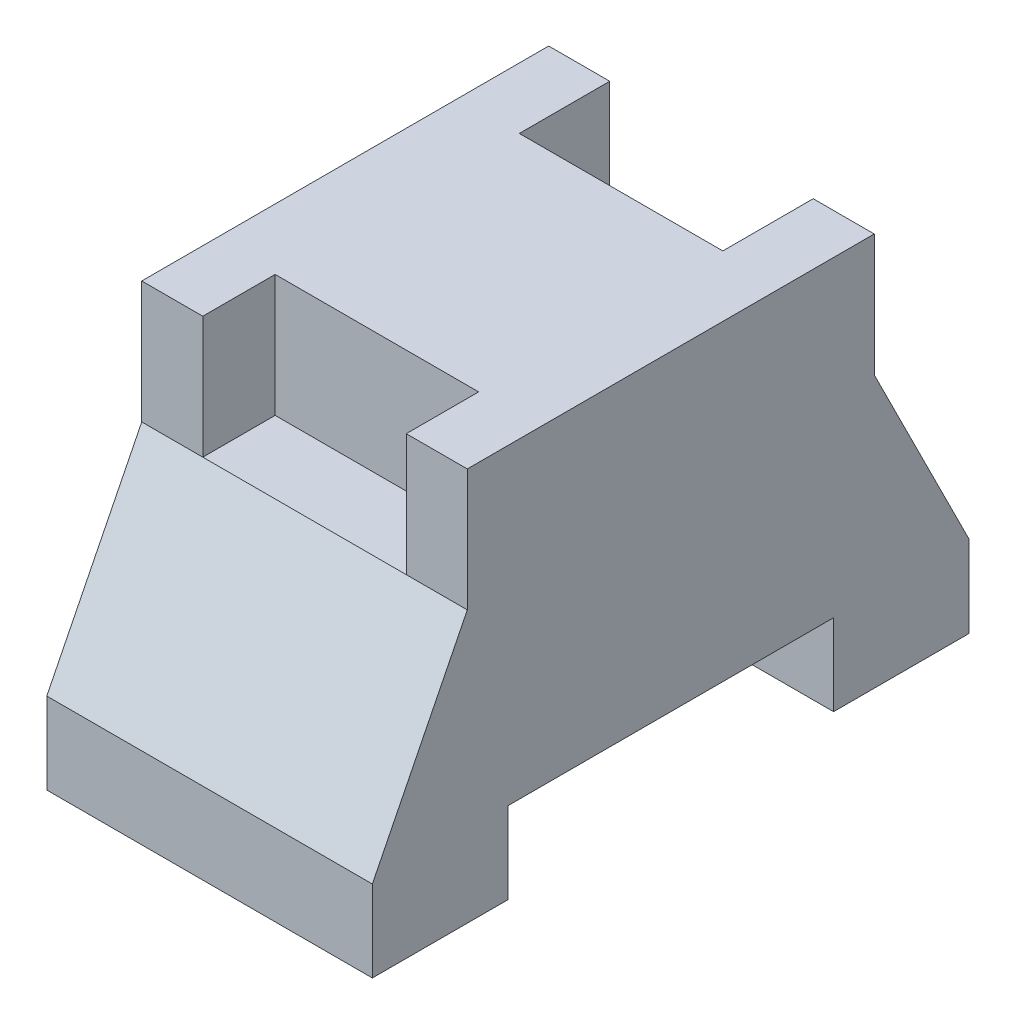
ISO-10303-21;
HEADER;
FILE_DESCRIPTION(('STEP AP214'),'2;1');
FILE_NAME('part.step','',(''),(''),'','','');
FILE_SCHEMA(('AUTOMOTIVE_DESIGN { 1 0 10303 214 1 1 1 1 }'));
ENDSEC;
DATA;
#1=APPLICATION_CONTEXT('core data for automotive mechanical design processes');
#2=APPLICATION_PROTOCOL_DEFINITION('international standard','automotive_design',2000,#1);
#3=PRODUCT_CONTEXT('',#1,'mechanical');
#4=PRODUCT('Part','Part','',(#3));
#5=PRODUCT_RELATED_PRODUCT_CATEGORY('part','',(#4));
#6=PRODUCT_DEFINITION_FORMATION('','',#4);
#7=PRODUCT_DEFINITION_CONTEXT('part definition',#1,'design');
#8=PRODUCT_DEFINITION('design','',#6,#7);
#9=PRODUCT_DEFINITION_SHAPE('','',#8);
#10=(LENGTH_UNIT() NAMED_UNIT(*) SI_UNIT(.MILLI.,.METRE.));
#11=(NAMED_UNIT(*) PLANE_ANGLE_UNIT() SI_UNIT($,.RADIAN.));
#12=(NAMED_UNIT(*) SI_UNIT($,.STERADIAN.) SOLID_ANGLE_UNIT());
#13=UNCERTAINTY_MEASURE_WITH_UNIT(LENGTH_MEASURE(1.E-05),#10,'distance_accuracy_value','');
#14=(GEOMETRIC_REPRESENTATION_CONTEXT(3) GLOBAL_UNCERTAINTY_ASSIGNED_CONTEXT((#13)) GLOBAL_UNIT_ASSIGNED_CONTEXT((#10,
#11,#12)) REPRESENTATION_CONTEXT('',''));
#15=CARTESIAN_POINT('',(0.,0.,0.));
#16=DIRECTION('',(0.,0.,1.));
#17=DIRECTION('',(1.,0.,0.));
#18=AXIS2_PLACEMENT_3D('',#15,#16,#17);
#19=CARTESIAN_POINT('',(-48.,0.,37.1891560630895));
#20=DIRECTION('',(0.,0.,-1.));
#21=DIRECTION('',(-1.,0.,0.));
#22=AXIS2_PLACEMENT_3D('',#19,#20,#21);
#23=PLANE('',#22);
#24=DIRECTION('',(1.,0.,0.));
#25=VECTOR('',#24,1.);
#26=CARTESIAN_POINT('',(-48.,28.,37.1891560630895));
#27=LINE('',#26,#25);
#28=CARTESIAN_POINT('',(-48.,28.,37.1891560630895));
#29=VERTEX_POINT('',#28);
#30=CARTESIAN_POINT('',(-39.,28.,37.1891560630895));
#31=VERTEX_POINT('',#30);
#32=EDGE_CURVE('E212',#29,#31,#27,.T.);
#33=ORIENTED_EDGE('',*,*,#32,.T.);
#34=DIRECTION('',(0.,1.,0.));
#35=VECTOR('',#34,1.);
#36=CARTESIAN_POINT('',(-39.,28.,37.1891560630895));
#37=LINE('',#36,#35);
#38=CARTESIAN_POINT('',(-39.,46.,37.1891560630895));
#39=VERTEX_POINT('',#38);
#40=EDGE_CURVE('E260',#31,#39,#37,.T.);
#41=ORIENTED_EDGE('',*,*,#40,.T.);
#42=DIRECTION('',(1.,0.,0.));
#43=VECTOR('',#42,1.);
#44=CARTESIAN_POINT('',(-48.,46.,37.1891560630895));
#45=LINE('',#44,#43);
#46=CARTESIAN_POINT('',(-48.,46.,37.1891560630895));
#47=VERTEX_POINT('',#46);
#48=EDGE_CURVE('E213',#47,#39,#45,.T.);
#49=ORIENTED_EDGE('',*,*,#48,.F.);
#50=DIRECTION('',(0.,1.,0.));
#51=VECTOR('',#50,1.);
#52=CARTESIAN_POINT('',(-48.,0.,37.1891560630895));
#53=LINE('',#52,#51);
#54=EDGE_CURVE('E357',#29,#47,#53,.T.);
#55=ORIENTED_EDGE('',*,*,#54,.F.);
#56=EDGE_LOOP('',(#33,#41,#49,#55));
#57=FACE_BOUND('',#56,.T.);
#58=ADVANCED_FACE('F39',(#57),#23,.F.);
#59=CARTESIAN_POINT('',(-48.,0.,-22.8108439369105));
#60=DIRECTION('',(0.,0.,1.));
#61=DIRECTION('',(0.,-1.,0.));
#62=AXIS2_PLACEMENT_3D('',#59,#60,#61);
#63=PLANE('',#62);
#64=DIRECTION('',(1.,0.,0.));
#65=VECTOR('',#64,1.);
#66=CARTESIAN_POINT('',(-48.,28.,-22.8108439369105));
#67=LINE('',#66,#65);
#68=CARTESIAN_POINT('',(-8.99999999999999,28.,-22.8108439369105));
#69=VERTEX_POINT('',#68);
#70=CARTESIAN_POINT('',(0.,28.,-22.8108439369105));
#71=VERTEX_POINT('',#70);
#72=EDGE_CURVE('E228',#69,#71,#67,.T.);
#73=ORIENTED_EDGE('',*,*,#72,.F.);
#74=DIRECTION('',(0.,1.,0.));
#75=VECTOR('',#74,1.);
#76=CARTESIAN_POINT('',(-8.99999999999999,28.,-22.8108439369105));
#77=LINE('',#76,#75);
#78=CARTESIAN_POINT('',(-8.99999999999999,46.,-22.8108439369105));
#79=VERTEX_POINT('',#78);
#80=EDGE_CURVE('E329',#69,#79,#77,.T.);
#81=ORIENTED_EDGE('',*,*,#80,.T.);
#82=DIRECTION('',(1.,0.,0.));
#83=VECTOR('',#82,1.);
#84=CARTESIAN_POINT('',(-48.,46.,-22.8108439369105));
#85=LINE('',#84,#83);
#86=CARTESIAN_POINT('',(0.,46.,-22.8108439369105));
#87=VERTEX_POINT('',#86);
#88=EDGE_CURVE('E224',#79,#87,#85,.T.);
#89=ORIENTED_EDGE('',*,*,#88,.T.);
#90=DIRECTION('',(0.,-1.,0.));
#91=VECTOR('',#90,1.);
#92=CARTESIAN_POINT('',(0.,0.,-22.8108439369105));
#93=LINE('',#92,#91);
#94=EDGE_CURVE('E268',#87,#71,#93,.T.);
#95=ORIENTED_EDGE('',*,*,#94,.T.);
#96=EDGE_LOOP('',(#73,#81,#89,#95));
#97=FACE_BOUND('',#96,.T.);
#98=ADVANCED_FACE('F376',(#97),#63,.F.);
#99=CARTESIAN_POINT('',(-48.,0.,0.));
#100=DIRECTION('',(0.,-1.,0.));
#101=DIRECTION('',(0.,0.,-1.));
#102=AXIS2_PLACEMENT_3D('',#99,#100,#101);
#103=PLANE('',#102);
#104=DIRECTION('',(0.,0.,-1.));
#105=VECTOR('',#104,1.);
#106=CARTESIAN_POINT('',(0.,0.,0.));
#107=LINE('',#106,#105);
#108=CARTESIAN_POINT('',(0.,0.,31.1891560630895));
#109=VERTEX_POINT('',#108);
#110=CARTESIAN_POINT('',(0.,0.,-16.8108439369105));
#111=VERTEX_POINT('',#110);
#112=EDGE_CURVE('E256',#109,#111,#107,.T.);
#113=ORIENTED_EDGE('',*,*,#112,.F.);
#114=DIRECTION('',(1.,0.,0.));
#115=VECTOR('',#114,1.);
#116=CARTESIAN_POINT('',(-48.,0.,31.1891560630895));
#117=LINE('',#116,#115);
#118=CARTESIAN_POINT('',(-48.,0.,31.1891560630895));
#119=VERTEX_POINT('',#118);
#120=EDGE_CURVE('E11',#119,#109,#117,.T.);
#121=ORIENTED_EDGE('',*,*,#120,.F.);
#122=DIRECTION('',(0.,0.,-1.));
#123=VECTOR('',#122,1.);
#124=CARTESIAN_POINT('',(-48.,0.,0.));
#125=LINE('',#124,#123);
#126=CARTESIAN_POINT('',(-48.,0.,-16.8108439369105));
#127=VERTEX_POINT('',#126);
#128=EDGE_CURVE('E284',#119,#127,#125,.T.);
#129=ORIENTED_EDGE('',*,*,#128,.T.);
#130=DIRECTION('',(1.,0.,0.));
#131=VECTOR('',#130,1.);
#132=CARTESIAN_POINT('',(-48.,0.,-16.8108439369105));
#133=LINE('',#132,#131);
#134=EDGE_CURVE('E43',#127,#111,#133,.T.);
#135=ORIENTED_EDGE('',*,*,#134,.T.);
#136=EDGE_LOOP('',(#113,#121,#129,#135));
#137=FACE_BOUND('',#136,.T.);
#138=ADVANCED_FACE('F41',(#137),#103,.T.);
#139=CARTESIAN_POINT('',(-48.,0.,31.1891560630895));
#140=DIRECTION('',(0.,0.,-1.));
#141=DIRECTION('',(-1.,0.,0.));
#142=AXIS2_PLACEMENT_3D('',#139,#140,#141);
#143=PLANE('',#142);
#144=DIRECTION('',(0.,1.,0.));
#145=VECTOR('',#144,1.);
#146=CARTESIAN_POINT('',(0.,0.,31.1891560630895));
#147=LINE('',#146,#145);
#148=CARTESIAN_POINT('',(0.,-12.,31.1891560630895));
#149=VERTEX_POINT('',#148);
#150=EDGE_CURVE('E282',#149,#109,#147,.T.);
#151=ORIENTED_EDGE('',*,*,#150,.F.);
#152=DIRECTION('',(1.,0.,0.));
#153=VECTOR('',#152,1.);
#154=CARTESIAN_POINT('',(-48.,-12.,31.1891560630895));
#155=LINE('',#154,#153);
#156=CARTESIAN_POINT('',(-48.,-12.,31.1891560630895));
#157=VERTEX_POINT('',#156);
#158=EDGE_CURVE('E48',#157,#149,#155,.T.);
#159=ORIENTED_EDGE('',*,*,#158,.F.);
#160=DIRECTION('',(0.,1.,0.));
#161=VECTOR('',#160,1.);
#162=CARTESIAN_POINT('',(-48.,0.,31.1891560630895));
#163=LINE('',#162,#161);
#164=EDGE_CURVE('E241',#157,#119,#163,.T.);
#165=ORIENTED_EDGE('',*,*,#164,.T.);
#166=ORIENTED_EDGE('',*,*,#120,.T.);
#167=EDGE_LOOP('',(#151,#159,#165,#166));
#168=FACE_BOUND('',#167,.T.);
#169=ADVANCED_FACE('F372',(#168),#143,.T.);
#170=CARTESIAN_POINT('',(-48.,-12.,0.));
#171=DIRECTION('',(0.,-1.,0.));
#172=DIRECTION('',(0.,0.,-1.));
#173=AXIS2_PLACEMENT_3D('',#170,#171,#172);
#174=PLANE('',#173);
#175=DIRECTION('',(0.,0.,-1.));
#176=VECTOR('',#175,1.);
#177=CARTESIAN_POINT('',(0.,-12.,0.));
#178=LINE('',#177,#176);
#179=CARTESIAN_POINT('',(0.,-12.,51.1891560630895));
#180=VERTEX_POINT('',#179);
#181=EDGE_CURVE('E279',#180,#149,#178,.T.);
#182=ORIENTED_EDGE('',*,*,#181,.F.);
#183=DIRECTION('',(1.,0.,0.));
#184=VECTOR('',#183,1.);
#185=CARTESIAN_POINT('',(-48.,-12.,51.1891560630895));
#186=LINE('',#185,#184);
#187=CARTESIAN_POINT('',(-48.,-12.,51.1891560630895));
#188=VERTEX_POINT('',#187);
#189=EDGE_CURVE('E286',#188,#180,#186,.T.);
#190=ORIENTED_EDGE('',*,*,#189,.F.);
#191=DIRECTION('',(0.,0.,-1.));
#192=VECTOR('',#191,1.);
#193=CARTESIAN_POINT('',(-48.,-12.,0.));
#194=LINE('',#193,#192);
#195=EDGE_CURVE('E247',#188,#157,#194,.T.);
#196=ORIENTED_EDGE('',*,*,#195,.T.);
#197=ORIENTED_EDGE('',*,*,#158,.T.);
#198=EDGE_LOOP('',(#182,#190,#196,#197));
#199=FACE_BOUND('',#198,.T.);
#200=ADVANCED_FACE('F365',(#199),#174,.T.);
#201=CARTESIAN_POINT('',(-48.,0.,51.1891560630895));
#202=DIRECTION('',(0.,0.,-1.));
#203=DIRECTION('',(-1.,0.,0.));
#204=AXIS2_PLACEMENT_3D('',#201,#202,#203);
#205=PLANE('',#204);
#206=DIRECTION('',(0.,1.,0.));
#207=VECTOR('',#206,1.);
#208=CARTESIAN_POINT('',(0.,0.,51.1891560630895));
#209=LINE('',#208,#207);
#210=CARTESIAN_POINT('',(0.,0.,51.1891560630895));
#211=VERTEX_POINT('',#210);
#212=EDGE_CURVE('E277',#180,#211,#209,.T.);
#213=ORIENTED_EDGE('',*,*,#212,.T.);
#214=DIRECTION('',(1.,0.,0.));
#215=VECTOR('',#214,1.);
#216=CARTESIAN_POINT('',(-48.,0.,51.1891560630895));
#217=LINE('',#216,#215);
#218=CARTESIAN_POINT('',(-48.,0.,51.1891560630895));
#219=VERTEX_POINT('',#218);
#220=EDGE_CURVE('E215',#219,#211,#217,.T.);
#221=ORIENTED_EDGE('',*,*,#220,.F.);
#222=DIRECTION('',(0.,1.,0.));
#223=VECTOR('',#222,1.);
#224=CARTESIAN_POINT('',(-48.,0.,51.1891560630895));
#225=LINE('',#224,#223);
#226=EDGE_CURVE('E252',#188,#219,#225,.T.);
#227=ORIENTED_EDGE('',*,*,#226,.F.);
#228=ORIENTED_EDGE('',*,*,#189,.T.);
#229=EDGE_LOOP('',(#213,#221,#227,#228));
#230=FACE_BOUND('',#229,.T.);
#231=ADVANCED_FACE('F363',(#230),#205,.F.);
#232=CARTESIAN_POINT('',(-48.,20.4756624252358,40.9513248504716));
#233=DIRECTION('',(0.,-0.447213595499958,-0.894427190999916));
#234=DIRECTION('',(0.,0.894427190999916,-0.447213595499958));
#235=AXIS2_PLACEMENT_3D('',#232,#233,#234);
#236=PLANE('',#235);
#237=DIRECTION('',(0.,0.894427190999916,-0.447213595499958));
#238=VECTOR('',#237,1.);
#239=CARTESIAN_POINT('',(0.,20.4756624252358,40.9513248504716));
#240=LINE('',#239,#238);
#241=CARTESIAN_POINT('',(0.,28.,37.1891560630895));
#242=VERTEX_POINT('',#241);
#243=EDGE_CURVE('E210',#211,#242,#240,.T.);
#244=ORIENTED_EDGE('',*,*,#243,.T.);
#245=CARTESIAN_POINT('',(-9.,28.,37.1891560630895));
#246=VERTEX_POINT('',#245);
#247=EDGE_CURVE('E203',#246,#242,#27,.T.);
#248=ORIENTED_EDGE('',*,*,#247,.F.);
#249=DIRECTION('',(1.,0.,0.));
#250=VECTOR('',#249,1.);
#251=CARTESIAN_POINT('',(-39.,28.,37.1891560630895));
#252=LINE('',#251,#250);
#253=EDGE_CURVE('E186',#31,#246,#252,.T.);
#254=ORIENTED_EDGE('',*,*,#253,.F.);
#255=ORIENTED_EDGE('',*,*,#32,.F.);
#256=DIRECTION('',(0.,0.894427190999916,-0.447213595499958));
#257=VECTOR('',#256,1.);
#258=CARTESIAN_POINT('',(-48.,20.4756624252358,40.9513248504716));
#259=LINE('',#258,#257);
#260=EDGE_CURVE('E292',#219,#29,#259,.T.);
#261=ORIENTED_EDGE('',*,*,#260,.F.);
#262=ORIENTED_EDGE('',*,*,#220,.T.);
#263=EDGE_LOOP('',(#244,#248,#254,#255,#261,#262));
#264=FACE_BOUND('',#263,.T.);
#265=ADVANCED_FACE('F207',(#264),#236,.F.);
#266=CARTESIAN_POINT('',(-8.99999999999999,46.,37.1891560630895));
#267=VERTEX_POINT('',#266);
#268=CARTESIAN_POINT('',(0.,46.,37.1891560630895));
#269=VERTEX_POINT('',#268);
#270=EDGE_CURVE('E205',#267,#269,#45,.T.);
#271=ORIENTED_EDGE('',*,*,#270,.F.);
#272=DIRECTION('',(0.,1.,0.));
#273=VECTOR('',#272,1.);
#274=CARTESIAN_POINT('',(-9.,28.,37.1891560630895));
#275=LINE('',#274,#273);
#276=EDGE_CURVE('E56',#246,#267,#275,.T.);
#277=ORIENTED_EDGE('',*,*,#276,.F.);
#278=ORIENTED_EDGE('',*,*,#247,.T.);
#279=DIRECTION('',(0.,1.,0.));
#280=VECTOR('',#279,1.);
#281=CARTESIAN_POINT('',(0.,0.,37.1891560630895));
#282=LINE('',#281,#280);
#283=EDGE_CURVE('E274',#242,#269,#282,.T.);
#284=ORIENTED_EDGE('',*,*,#283,.T.);
#285=EDGE_LOOP('',(#271,#277,#278,#284));
#286=FACE_BOUND('',#285,.T.);
#287=ADVANCED_FACE('F201',(#286),#23,.F.);
#288=CARTESIAN_POINT('',(-48.,46.,0.));
#289=DIRECTION('',(0.,-1.,0.));
#290=DIRECTION('',(0.,0.,-1.));
#291=AXIS2_PLACEMENT_3D('',#288,#289,#290);
#292=PLANE('',#291);
#293=ORIENTED_EDGE('',*,*,#48,.T.);
#294=DIRECTION('',(0.,0.,1.));
#295=VECTOR('',#294,1.);
#296=CARTESIAN_POINT('',(-39.,46.,37.1891560630895));
#297=LINE('',#296,#295);
#298=CARTESIAN_POINT('',(-39.,46.,26.5178677111091));
#299=VERTEX_POINT('',#298);
#300=EDGE_CURVE('E197',#299,#39,#297,.T.);
#301=ORIENTED_EDGE('',*,*,#300,.F.);
#302=DIRECTION('',(-1.,0.,0.));
#303=VECTOR('',#302,1.);
#304=CARTESIAN_POINT('',(-39.,46.,26.5178677111091));
#305=LINE('',#304,#303);
#306=CARTESIAN_POINT('',(-9.,46.,26.5178677111091));
#307=VERTEX_POINT('',#306);
#308=EDGE_CURVE('E307',#307,#299,#305,.T.);
#309=ORIENTED_EDGE('',*,*,#308,.F.);
#310=DIRECTION('',(0.,0.,-1.));
#311=VECTOR('',#310,1.);
#312=CARTESIAN_POINT('',(-9.,46.,26.5178677111091));
#313=LINE('',#312,#311);
#314=EDGE_CURVE('E304',#267,#307,#313,.T.);
#315=ORIENTED_EDGE('',*,*,#314,.F.);
#316=ORIENTED_EDGE('',*,*,#270,.T.);
#317=DIRECTION('',(0.,0.,-1.));
#318=VECTOR('',#317,1.);
#319=CARTESIAN_POINT('',(0.,46.,0.));
#320=LINE('',#319,#318);
#321=EDGE_CURVE('E271',#269,#87,#320,.T.);
#322=ORIENTED_EDGE('',*,*,#321,.T.);
#323=ORIENTED_EDGE('',*,*,#88,.F.);
#324=DIRECTION('',(0.,0.,-1.));
#325=VECTOR('',#324,1.);
#326=CARTESIAN_POINT('',(-8.99999999999999,46.,-9.48213228889091));
#327=LINE('',#326,#325);
#328=CARTESIAN_POINT('',(-8.99999999999999,46.,-9.48213228889091));
#329=VERTEX_POINT('',#328);
#330=EDGE_CURVE('E332',#329,#79,#327,.T.);
#331=ORIENTED_EDGE('',*,*,#330,.F.);
#332=DIRECTION('',(1.,0.,0.));
#333=VECTOR('',#332,1.);
#334=CARTESIAN_POINT('',(-39.,46.,-9.48213228889091));
#335=LINE('',#334,#333);
#336=CARTESIAN_POINT('',(-39.,46.,-9.48213228889091));
#337=VERTEX_POINT('',#336);
#338=EDGE_CURVE('E312',#337,#329,#335,.T.);
#339=ORIENTED_EDGE('',*,*,#338,.F.);
#340=DIRECTION('',(0.,0.,1.));
#341=VECTOR('',#340,1.);
#342=CARTESIAN_POINT('',(-39.,46.,-22.8108439369105));
#343=LINE('',#342,#341);
#344=CARTESIAN_POINT('',(-39.,46.,-22.8108439369105));
#345=VERTEX_POINT('',#344);
#346=EDGE_CURVE('E308',#345,#337,#343,.T.);
#347=ORIENTED_EDGE('',*,*,#346,.F.);
#348=CARTESIAN_POINT('',(-48.,46.,-22.8108439369105));
#349=VERTEX_POINT('',#348);
#350=EDGE_CURVE('E221',#349,#345,#85,.T.);
#351=ORIENTED_EDGE('',*,*,#350,.F.);
#352=DIRECTION('',(0.,0.,-1.));
#353=VECTOR('',#352,1.);
#354=CARTESIAN_POINT('',(-48.,46.,0.));
#355=LINE('',#354,#353);
#356=EDGE_CURVE('E355',#47,#349,#355,.T.);
#357=ORIENTED_EDGE('',*,*,#356,.F.);
#358=EDGE_LOOP('',(#293,#301,#309,#315,#316,#322,#323,#331,#339,#347,#351,#357));
#359=FACE_BOUND('',#358,.T.);
#360=ADVANCED_FACE('F301',(#359),#292,.F.);
#361=ORIENTED_EDGE('',*,*,#350,.T.);
#362=DIRECTION('',(0.,1.,0.));
#363=VECTOR('',#362,1.);
#364=CARTESIAN_POINT('',(-39.,28.,-22.8108439369105));
#365=LINE('',#364,#363);
#366=CARTESIAN_POINT('',(-39.,28.,-22.8108439369105));
#367=VERTEX_POINT('',#366);
#368=EDGE_CURVE('E323',#367,#345,#365,.T.);
#369=ORIENTED_EDGE('',*,*,#368,.F.);
#370=CARTESIAN_POINT('',(-48.,28.,-22.8108439369105));
#371=VERTEX_POINT('',#370);
#372=EDGE_CURVE('E225',#371,#367,#67,.T.);
#373=ORIENTED_EDGE('',*,*,#372,.F.);
#374=DIRECTION('',(0.,-1.,0.));
#375=VECTOR('',#374,1.);
#376=CARTESIAN_POINT('',(-48.,0.,-22.8108439369105));
#377=LINE('',#376,#375);
#378=EDGE_CURVE('E353',#349,#371,#377,.T.);
#379=ORIENTED_EDGE('',*,*,#378,.F.);
#380=EDGE_LOOP('',(#361,#369,#373,#379));
#381=FACE_BOUND('',#380,.T.);
#382=ADVANCED_FACE('F384',(#381),#63,.F.);
#383=CARTESIAN_POINT('',(-48.,14.7243375747642,-29.4486751495284));
#384=DIRECTION('',(0.,-0.447213595499958,0.894427190999916));
#385=DIRECTION('',(0.,-0.894427190999916,-0.447213595499958));
#386=AXIS2_PLACEMENT_3D('',#383,#384,#385);
#387=PLANE('',#386);
#388=DIRECTION('',(0.,-0.894427190999916,-0.447213595499958));
#389=VECTOR('',#388,1.);
#390=CARTESIAN_POINT('',(0.,14.7243375747642,-29.4486751495284));
#391=LINE('',#390,#389);
#392=CARTESIAN_POINT('',(0.,0.,-36.8108439369105));
#393=VERTEX_POINT('',#392);
#394=EDGE_CURVE('E266',#71,#393,#391,.T.);
#395=ORIENTED_EDGE('',*,*,#394,.T.);
#396=DIRECTION('',(1.,0.,0.));
#397=VECTOR('',#396,1.);
#398=CARTESIAN_POINT('',(-48.,0.,-36.8108439369105));
#399=LINE('',#398,#397);
#400=CARTESIAN_POINT('',(-48.,0.,-36.8108439369105));
#401=VERTEX_POINT('',#400);
#402=EDGE_CURVE('E229',#401,#393,#399,.T.);
#403=ORIENTED_EDGE('',*,*,#402,.F.);
#404=DIRECTION('',(0.,-0.894427190999916,-0.447213595499958));
#405=VECTOR('',#404,1.);
#406=CARTESIAN_POINT('',(-48.,14.7243375747642,-29.4486751495284));
#407=LINE('',#406,#405);
#408=EDGE_CURVE('E351',#371,#401,#407,.T.);
#409=ORIENTED_EDGE('',*,*,#408,.F.);
#410=ORIENTED_EDGE('',*,*,#372,.T.);
#411=DIRECTION('',(-1.,0.,0.));
#412=VECTOR('',#411,1.);
#413=CARTESIAN_POINT('',(-8.99999999999999,28.,-22.8108439369105));
#414=LINE('',#413,#412);
#415=EDGE_CURVE('E334',#69,#367,#414,.T.);
#416=ORIENTED_EDGE('',*,*,#415,.F.);
#417=ORIENTED_EDGE('',*,*,#72,.T.);
#418=EDGE_LOOP('',(#395,#403,#409,#410,#416,#417));
#419=FACE_BOUND('',#418,.T.);
#420=ADVANCED_FACE('F393',(#419),#387,.F.);
#421=CARTESIAN_POINT('',(-48.,0.,-36.8108439369105));
#422=DIRECTION('',(0.,0.,1.));
#423=DIRECTION('',(1.,0.,0.));
#424=AXIS2_PLACEMENT_3D('',#421,#422,#423);
#425=PLANE('',#424);
#426=DIRECTION('',(0.,-1.,0.));
#427=VECTOR('',#426,1.);
#428=CARTESIAN_POINT('',(0.,0.,-36.8108439369105));
#429=LINE('',#428,#427);
#430=CARTESIAN_POINT('',(0.,-12.,-36.8108439369105));
#431=VERTEX_POINT('',#430);
#432=EDGE_CURVE('E264',#393,#431,#429,.T.);
#433=ORIENTED_EDGE('',*,*,#432,.T.);
#434=DIRECTION('',(1.,0.,0.));
#435=VECTOR('',#434,1.);
#436=CARTESIAN_POINT('',(-48.,-12.,-36.8108439369105));
#437=LINE('',#436,#435);
#438=CARTESIAN_POINT('',(-48.,-12.,-36.8108439369105));
#439=VERTEX_POINT('',#438);
#440=EDGE_CURVE('E232',#439,#431,#437,.T.);
#441=ORIENTED_EDGE('',*,*,#440,.F.);
#442=DIRECTION('',(0.,-1.,0.));
#443=VECTOR('',#442,1.);
#444=CARTESIAN_POINT('',(-48.,0.,-36.8108439369105));
#445=LINE('',#444,#443);
#446=EDGE_CURVE('E349',#401,#439,#445,.T.);
#447=ORIENTED_EDGE('',*,*,#446,.F.);
#448=ORIENTED_EDGE('',*,*,#402,.T.);
#449=EDGE_LOOP('',(#433,#441,#447,#448));
#450=FACE_BOUND('',#449,.T.);
#451=ADVANCED_FACE('F398',(#450),#425,.F.);
#452=CARTESIAN_POINT('',(-48.,-12.,0.));
#453=DIRECTION('',(0.,1.,0.));
#454=DIRECTION('',(0.,0.,1.));
#455=AXIS2_PLACEMENT_3D('',#452,#453,#454);
#456=PLANE('',#455);
#457=DIRECTION('',(0.,0.,1.));
#458=VECTOR('',#457,1.);
#459=CARTESIAN_POINT('',(0.,-12.,0.));
#460=LINE('',#459,#458);
#461=CARTESIAN_POINT('',(0.,-12.,-16.8108439369105));
#462=VERTEX_POINT('',#461);
#463=EDGE_CURVE('E262',#431,#462,#460,.T.);
#464=ORIENTED_EDGE('',*,*,#463,.T.);
#465=DIRECTION('',(1.,0.,0.));
#466=VECTOR('',#465,1.);
#467=CARTESIAN_POINT('',(-48.,-12.,-16.8108439369105));
#468=LINE('',#467,#466);
#469=CARTESIAN_POINT('',(-48.,-12.,-16.8108439369105));
#470=VERTEX_POINT('',#469);
#471=EDGE_CURVE('E234',#470,#462,#468,.T.);
#472=ORIENTED_EDGE('',*,*,#471,.F.);
#473=DIRECTION('',(0.,0.,1.));
#474=VECTOR('',#473,1.);
#475=CARTESIAN_POINT('',(-48.,-12.,0.));
#476=LINE('',#475,#474);
#477=EDGE_CURVE('E347',#439,#470,#476,.T.);
#478=ORIENTED_EDGE('',*,*,#477,.F.);
#479=ORIENTED_EDGE('',*,*,#440,.T.);
#480=EDGE_LOOP('',(#464,#472,#478,#479));
#481=FACE_BOUND('',#480,.T.);
#482=ADVANCED_FACE('F402',(#481),#456,.F.);
#483=CARTESIAN_POINT('',(-48.,0.,-16.8108439369105));
#484=DIRECTION('',(0.,0.,-1.));
#485=DIRECTION('',(-1.,0.,0.));
#486=AXIS2_PLACEMENT_3D('',#483,#484,#485);
#487=PLANE('',#486);
#488=DIRECTION('',(0.,1.,0.));
#489=VECTOR('',#488,1.);
#490=CARTESIAN_POINT('',(0.,0.,-16.8108439369105));
#491=LINE('',#490,#489);
#492=EDGE_CURVE('E259',#462,#111,#491,.T.);
#493=ORIENTED_EDGE('',*,*,#492,.T.);
#494=ORIENTED_EDGE('',*,*,#134,.F.);
#495=DIRECTION('',(0.,1.,0.));
#496=VECTOR('',#495,1.);
#497=CARTESIAN_POINT('',(-48.,0.,-16.8108439369105));
#498=LINE('',#497,#496);
#499=EDGE_CURVE('E345',#470,#127,#498,.T.);
#500=ORIENTED_EDGE('',*,*,#499,.F.);
#501=ORIENTED_EDGE('',*,*,#471,.T.);
#502=EDGE_LOOP('',(#493,#494,#500,#501));
#503=FACE_BOUND('',#502,.T.);
#504=ADVANCED_FACE('F405',(#503),#487,.F.);
#505=CARTESIAN_POINT('',(-48.,0.,0.));
#506=DIRECTION('',(1.,0.,0.));
#507=DIRECTION('',(0.,0.,-1.));
#508=AXIS2_PLACEMENT_3D('',#505,#506,#507);
#509=PLANE('',#508);
#510=ORIENTED_EDGE('',*,*,#128,.F.);
#511=ORIENTED_EDGE('',*,*,#164,.F.);
#512=ORIENTED_EDGE('',*,*,#195,.F.);
#513=ORIENTED_EDGE('',*,*,#226,.T.);
#514=ORIENTED_EDGE('',*,*,#260,.T.);
#515=ORIENTED_EDGE('',*,*,#54,.T.);
#516=ORIENTED_EDGE('',*,*,#356,.T.);
#517=ORIENTED_EDGE('',*,*,#378,.T.);
#518=ORIENTED_EDGE('',*,*,#408,.T.);
#519=ORIENTED_EDGE('',*,*,#446,.T.);
#520=ORIENTED_EDGE('',*,*,#477,.T.);
#521=ORIENTED_EDGE('',*,*,#499,.T.);
#522=EDGE_LOOP('',(#510,#511,#512,#513,#514,#515,#516,#517,#518,#519,#520,#521));
#523=FACE_BOUND('',#522,.T.);
#524=ADVANCED_FACE('F362',(#523),#509,.F.);
#525=CARTESIAN_POINT('',(0.,0.,0.));
#526=DIRECTION('',(1.,0.,0.));
#527=DIRECTION('',(0.,0.,-1.));
#528=AXIS2_PLACEMENT_3D('',#525,#526,#527);
#529=PLANE('',#528);
#530=ORIENTED_EDGE('',*,*,#112,.T.);
#531=ORIENTED_EDGE('',*,*,#492,.F.);
#532=ORIENTED_EDGE('',*,*,#463,.F.);
#533=ORIENTED_EDGE('',*,*,#432,.F.);
#534=ORIENTED_EDGE('',*,*,#394,.F.);
#535=ORIENTED_EDGE('',*,*,#94,.F.);
#536=ORIENTED_EDGE('',*,*,#321,.F.);
#537=ORIENTED_EDGE('',*,*,#283,.F.);
#538=ORIENTED_EDGE('',*,*,#243,.F.);
#539=ORIENTED_EDGE('',*,*,#212,.F.);
#540=ORIENTED_EDGE('',*,*,#181,.T.);
#541=ORIENTED_EDGE('',*,*,#150,.T.);
#542=EDGE_LOOP('',(#530,#531,#532,#533,#534,#535,#536,#537,#538,#539,#540,#541));
#543=FACE_BOUND('',#542,.T.);
#544=ADVANCED_FACE('F294',(#543),#529,.T.);
#545=CARTESIAN_POINT('',(-8.99999999999999,28.,-9.48213228889091));
#546=DIRECTION('',(1.,0.,0.));
#547=DIRECTION('',(0.,0.,-1.));
#548=AXIS2_PLACEMENT_3D('',#545,#546,#547);
#549=PLANE('',#548);
#550=ORIENTED_EDGE('',*,*,#330,.T.);
#551=ORIENTED_EDGE('',*,*,#80,.F.);
#552=DIRECTION('',(0.,0.,-1.));
#553=VECTOR('',#552,1.);
#554=CARTESIAN_POINT('',(-8.99999999999999,28.,-9.48213228889091));
#555=LINE('',#554,#553);
#556=CARTESIAN_POINT('',(-8.99999999999999,28.,-9.48213228889091));
#557=VERTEX_POINT('',#556);
#558=EDGE_CURVE('E64',#557,#69,#555,.T.);
#559=ORIENTED_EDGE('',*,*,#558,.F.);
#560=DIRECTION('',(0.,1.,0.));
#561=VECTOR('',#560,1.);
#562=CARTESIAN_POINT('',(-8.99999999999999,28.,-9.48213228889091));
#563=LINE('',#562,#561);
#564=EDGE_CURVE('E327',#557,#329,#563,.T.);
#565=ORIENTED_EDGE('',*,*,#564,.T.);
#566=EDGE_LOOP('',(#550,#551,#559,#565));
#567=FACE_BOUND('',#566,.T.);
#568=ADVANCED_FACE('F423',(#567),#549,.F.);
#569=CARTESIAN_POINT('',(-39.,28.,-9.48213228889091));
#570=DIRECTION('',(0.,0.,1.));
#571=DIRECTION('',(0.,-1.,0.));
#572=AXIS2_PLACEMENT_3D('',#569,#570,#571);
#573=PLANE('',#572);
#574=ORIENTED_EDGE('',*,*,#338,.T.);
#575=ORIENTED_EDGE('',*,*,#564,.F.);
#576=DIRECTION('',(1.,0.,0.));
#577=VECTOR('',#576,1.);
#578=CARTESIAN_POINT('',(-39.,28.,-9.48213228889091));
#579=LINE('',#578,#577);
#580=CARTESIAN_POINT('',(-39.,28.,-9.48213228889091));
#581=VERTEX_POINT('',#580);
#582=EDGE_CURVE('E338',#581,#557,#579,.T.);
#583=ORIENTED_EDGE('',*,*,#582,.F.);
#584=DIRECTION('',(0.,1.,0.));
#585=VECTOR('',#584,1.);
#586=CARTESIAN_POINT('',(-39.,28.,-9.48213228889091));
#587=LINE('',#586,#585);
#588=EDGE_CURVE('E325',#581,#337,#587,.T.);
#589=ORIENTED_EDGE('',*,*,#588,.T.);
#590=EDGE_LOOP('',(#574,#575,#583,#589));
#591=FACE_BOUND('',#590,.T.);
#592=ADVANCED_FACE('F428',(#591),#573,.F.);
#593=CARTESIAN_POINT('',(-39.,28.,-22.8108439369105));
#594=DIRECTION('',(-1.,0.,0.));
#595=DIRECTION('',(0.,0.,1.));
#596=AXIS2_PLACEMENT_3D('',#593,#594,#595);
#597=PLANE('',#596);
#598=ORIENTED_EDGE('',*,*,#346,.T.);
#599=ORIENTED_EDGE('',*,*,#588,.F.);
#600=DIRECTION('',(0.,0.,1.));
#601=VECTOR('',#600,1.);
#602=CARTESIAN_POINT('',(-39.,28.,-22.8108439369105));
#603=LINE('',#602,#601);
#604=EDGE_CURVE('E340',#367,#581,#603,.T.);
#605=ORIENTED_EDGE('',*,*,#604,.F.);
#606=ORIENTED_EDGE('',*,*,#368,.T.);
#607=EDGE_LOOP('',(#598,#599,#605,#606));
#608=FACE_BOUND('',#607,.T.);
#609=ADVANCED_FACE('F431',(#608),#597,.F.);
#610=CARTESIAN_POINT('',(0.,28.,0.));
#611=DIRECTION('',(0.,1.,0.));
#612=DIRECTION('',(0.,0.,1.));
#613=AXIS2_PLACEMENT_3D('',#610,#611,#612);
#614=PLANE('',#613);
#615=ORIENTED_EDGE('',*,*,#415,.T.);
#616=ORIENTED_EDGE('',*,*,#604,.T.);
#617=ORIENTED_EDGE('',*,*,#582,.T.);
#618=ORIENTED_EDGE('',*,*,#558,.T.);
#619=EDGE_LOOP('',(#615,#616,#617,#618));
#620=FACE_BOUND('',#619,.T.);
#621=ADVANCED_FACE('F449',(#620),#614,.T.);
#622=CARTESIAN_POINT('',(-39.,28.,37.1891560630895));
#623=DIRECTION('',(-1.,0.,0.));
#624=DIRECTION('',(0.,0.,1.));
#625=AXIS2_PLACEMENT_3D('',#622,#623,#624);
#626=PLANE('',#625);
#627=ORIENTED_EDGE('',*,*,#300,.T.);
#628=ORIENTED_EDGE('',*,*,#40,.F.);
#629=DIRECTION('',(0.,0.,1.));
#630=VECTOR('',#629,1.);
#631=CARTESIAN_POINT('',(-39.,28.,37.1891560630895));
#632=LINE('',#631,#630);
#633=CARTESIAN_POINT('',(-39.,28.,26.5178677111091));
#634=VERTEX_POINT('',#633);
#635=EDGE_CURVE('E192',#634,#31,#632,.T.);
#636=ORIENTED_EDGE('',*,*,#635,.F.);
#637=DIRECTION('',(0.,1.,0.));
#638=VECTOR('',#637,1.);
#639=CARTESIAN_POINT('',(-39.,28.,26.5178677111091));
#640=LINE('',#639,#638);
#641=EDGE_CURVE('E320',#634,#299,#640,.T.);
#642=ORIENTED_EDGE('',*,*,#641,.T.);
#643=EDGE_LOOP('',(#627,#628,#636,#642));
#644=FACE_BOUND('',#643,.T.);
#645=ADVANCED_FACE('F439',(#644),#626,.F.);
#646=CARTESIAN_POINT('',(-39.,28.,26.5178677111091));
#647=DIRECTION('',(0.,0.,-1.));
#648=DIRECTION('',(0.,1.,0.));
#649=AXIS2_PLACEMENT_3D('',#646,#647,#648);
#650=PLANE('',#649);
#651=ORIENTED_EDGE('',*,*,#308,.T.);
#652=ORIENTED_EDGE('',*,*,#641,.F.);
#653=DIRECTION('',(-1.,0.,0.));
#654=VECTOR('',#653,1.);
#655=CARTESIAN_POINT('',(-39.,28.,26.5178677111091));
#656=LINE('',#655,#654);
#657=CARTESIAN_POINT('',(-9.,28.,26.5178677111091));
#658=VERTEX_POINT('',#657);
#659=EDGE_CURVE('E185',#658,#634,#656,.T.);
#660=ORIENTED_EDGE('',*,*,#659,.F.);
#661=DIRECTION('',(0.,1.,0.));
#662=VECTOR('',#661,1.);
#663=CARTESIAN_POINT('',(-9.,28.,26.5178677111091));
#664=LINE('',#663,#662);
#665=EDGE_CURVE('E181',#658,#307,#664,.T.);
#666=ORIENTED_EDGE('',*,*,#665,.T.);
#667=EDGE_LOOP('',(#651,#652,#660,#666));
#668=FACE_BOUND('',#667,.T.);
#669=ADVANCED_FACE('F441',(#668),#650,.F.);
#670=CARTESIAN_POINT('',(-9.,28.,26.5178677111091));
#671=DIRECTION('',(1.,0.,0.));
#672=DIRECTION('',(0.,0.,-1.));
#673=AXIS2_PLACEMENT_3D('',#670,#671,#672);
#674=PLANE('',#673);
#675=ORIENTED_EDGE('',*,*,#314,.T.);
#676=ORIENTED_EDGE('',*,*,#665,.F.);
#677=DIRECTION('',(0.,0.,-1.));
#678=VECTOR('',#677,1.);
#679=CARTESIAN_POINT('',(-9.,28.,26.5178677111091));
#680=LINE('',#679,#678);
#681=EDGE_CURVE('E178',#246,#658,#680,.T.);
#682=ORIENTED_EDGE('',*,*,#681,.F.);
#683=ORIENTED_EDGE('',*,*,#276,.T.);
#684=EDGE_LOOP('',(#675,#676,#682,#683));
#685=FACE_BOUND('',#684,.T.);
#686=ADVANCED_FACE('F180',(#685),#674,.F.);
#687=CARTESIAN_POINT('',(0.,28.,0.));
#688=DIRECTION('',(0.,-1.,0.));
#689=DIRECTION('',(0.,0.,-1.));
#690=AXIS2_PLACEMENT_3D('',#687,#688,#689);
#691=PLANE('',#690);
#692=ORIENTED_EDGE('',*,*,#253,.T.);
#693=ORIENTED_EDGE('',*,*,#681,.T.);
#694=ORIENTED_EDGE('',*,*,#659,.T.);
#695=ORIENTED_EDGE('',*,*,#635,.T.);
#696=EDGE_LOOP('',(#692,#693,#694,#695));
#697=FACE_BOUND('',#696,.T.);
#698=ADVANCED_FACE('F190',(#697),#691,.F.);
#699=CLOSED_SHELL('',(#58,#98,#138,#169,#200,#231,#265,#287,#360,#382,#420,#451,#482,#504,#524,
#544,#568,#592,#609,#621,#645,#669,#686,#698));
#700=MANIFOLD_SOLID_BREP('B2',#699);
#701=ADVANCED_BREP_SHAPE_REPRESENTATION('',(#18,#700),#14);
#702=SHAPE_DEFINITION_REPRESENTATION(#9,#701);
ENDSEC;
END-ISO-10303-21;
